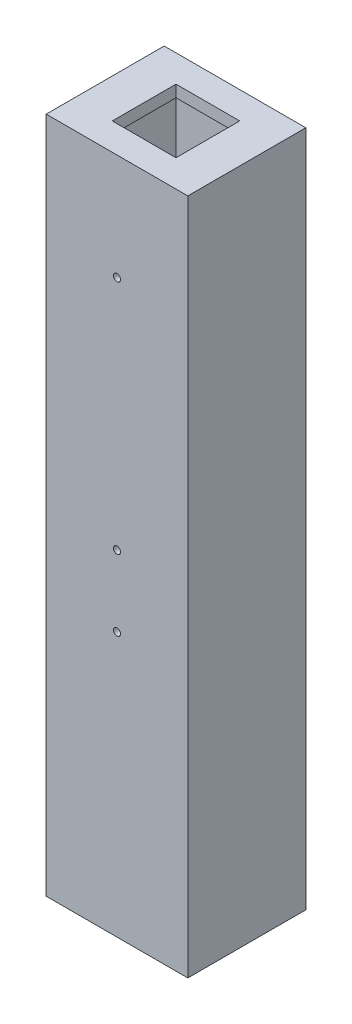
ISO-10303-21;
HEADER;
FILE_DESCRIPTION(('STEP AP214'),'2;1');
FILE_NAME('part.step','',(''),(''),'','','');
FILE_SCHEMA(('AUTOMOTIVE_DESIGN { 1 0 10303 214 1 1 1 1 }'));
ENDSEC;
DATA;
#1=APPLICATION_CONTEXT('core data for automotive mechanical design processes');
#2=APPLICATION_PROTOCOL_DEFINITION('international standard','automotive_design',2000,#1);
#3=PRODUCT_CONTEXT('',#1,'mechanical');
#4=PRODUCT('Part','Part','',(#3));
#5=PRODUCT_RELATED_PRODUCT_CATEGORY('part','',(#4));
#6=PRODUCT_DEFINITION_FORMATION('','',#4);
#7=PRODUCT_DEFINITION_CONTEXT('part definition',#1,'design');
#8=PRODUCT_DEFINITION('design','',#6,#7);
#9=PRODUCT_DEFINITION_SHAPE('','',#8);
#10=(LENGTH_UNIT() NAMED_UNIT(*) SI_UNIT(.MILLI.,.METRE.));
#11=(NAMED_UNIT(*) PLANE_ANGLE_UNIT() SI_UNIT($,.RADIAN.));
#12=(NAMED_UNIT(*) SI_UNIT($,.STERADIAN.) SOLID_ANGLE_UNIT());
#13=UNCERTAINTY_MEASURE_WITH_UNIT(LENGTH_MEASURE(1.E-05),#10,'distance_accuracy_value','');
#14=(GEOMETRIC_REPRESENTATION_CONTEXT(3) GLOBAL_UNCERTAINTY_ASSIGNED_CONTEXT((#13)) GLOBAL_UNIT_ASSIGNED_CONTEXT((#10,
#11,#12)) REPRESENTATION_CONTEXT('',''));
#15=CARTESIAN_POINT('',(0.,0.,0.));
#16=DIRECTION('',(0.,0.,1.));
#17=DIRECTION('',(1.,0.,0.));
#18=AXIS2_PLACEMENT_3D('',#15,#16,#17);
#19=CARTESIAN_POINT('',(0.,0.,0.));
#20=DIRECTION('',(0.,1.,0.));
#21=DIRECTION('',(0.,0.,1.));
#22=AXIS2_PLACEMENT_3D('',#19,#20,#21);
#23=PLANE('',#22);
#24=DIRECTION('',(1.,0.,0.));
#25=VECTOR('',#24,1.);
#26=CARTESIAN_POINT('',(0.,0.,-3.1));
#27=LINE('',#26,#25);
#28=CARTESIAN_POINT('',(-3.1,0.,-3.1));
#29=VERTEX_POINT('',#28);
#30=CARTESIAN_POINT('',(3.1,0.,-3.1));
#31=VERTEX_POINT('',#30);
#32=EDGE_CURVE('E294',#29,#31,#27,.T.);
#33=ORIENTED_EDGE('',*,*,#32,.F.);
#34=DIRECTION('',(0.,0.,1.));
#35=VECTOR('',#34,1.);
#36=CARTESIAN_POINT('',(-3.1,0.,0.));
#37=LINE('',#36,#35);
#38=CARTESIAN_POINT('',(-3.1,0.,3.1));
#39=VERTEX_POINT('',#38);
#40=EDGE_CURVE('E299',#29,#39,#37,.T.);
#41=ORIENTED_EDGE('',*,*,#40,.T.);
#42=DIRECTION('',(1.,0.,0.));
#43=VECTOR('',#42,1.);
#44=CARTESIAN_POINT('',(0.,0.,3.1));
#45=LINE('',#44,#43);
#46=CARTESIAN_POINT('',(3.1,0.,3.1));
#47=VERTEX_POINT('',#46);
#48=EDGE_CURVE('E312',#39,#47,#45,.T.);
#49=ORIENTED_EDGE('',*,*,#48,.T.);
#50=DIRECTION('',(0.,0.,1.));
#51=VECTOR('',#50,1.);
#52=CARTESIAN_POINT('',(3.1,0.,0.));
#53=LINE('',#52,#51);
#54=EDGE_CURVE('E309',#31,#47,#53,.T.);
#55=ORIENTED_EDGE('',*,*,#54,.F.);
#56=EDGE_LOOP('',(#33,#41,#49,#55));
#57=FACE_BOUND('',#56,.T.);
#58=DIRECTION('',(1.,0.,0.));
#59=VECTOR('',#58,1.);
#60=CARTESIAN_POINT('',(-3.6,0.,3.6));
#61=LINE('',#60,#59);
#62=CARTESIAN_POINT('',(-3.6,0.,3.6));
#63=VERTEX_POINT('',#62);
#64=CARTESIAN_POINT('',(3.6,0.,3.6));
#65=VERTEX_POINT('',#64);
#66=EDGE_CURVE('E106',#63,#65,#61,.T.);
#67=ORIENTED_EDGE('',*,*,#66,.F.);
#68=DIRECTION('',(0.,0.,-1.));
#69=VECTOR('',#68,1.);
#70=CARTESIAN_POINT('',(-3.6,0.,3.6));
#71=LINE('',#70,#69);
#72=CARTESIAN_POINT('',(-3.6,0.,-3.6));
#73=VERTEX_POINT('',#72);
#74=EDGE_CURVE('E111',#63,#73,#71,.T.);
#75=ORIENTED_EDGE('',*,*,#74,.T.);
#76=DIRECTION('',(1.,0.,0.));
#77=VECTOR('',#76,1.);
#78=CARTESIAN_POINT('',(-3.6,0.,-3.6));
#79=LINE('',#78,#77);
#80=CARTESIAN_POINT('',(3.6,0.,-3.6));
#81=VERTEX_POINT('',#80);
#82=EDGE_CURVE('E226',#73,#81,#79,.T.);
#83=ORIENTED_EDGE('',*,*,#82,.T.);
#84=DIRECTION('',(0.,0.,-1.));
#85=VECTOR('',#84,1.);
#86=CARTESIAN_POINT('',(3.6,0.,3.6));
#87=LINE('',#86,#85);
#88=EDGE_CURVE('E235',#65,#81,#87,.T.);
#89=ORIENTED_EDGE('',*,*,#88,.F.);
#90=EDGE_LOOP('',(#67,#75,#83,#89));
#91=FACE_BOUND('',#90,.T.);
#92=ADVANCED_FACE('F91',(#57,#91),#23,.F.);
#93=CARTESIAN_POINT('',(0.,54.,-3.1));
#94=DIRECTION('',(0.,0.,-1.));
#95=DIRECTION('',(-1.,0.,0.));
#96=AXIS2_PLACEMENT_3D('',#93,#94,#95);
#97=PLANE('',#96);
#98=CARTESIAN_POINT('',(0.,19.,-3.1));
#99=DIRECTION('',(0.,0.,-1.));
#100=DIRECTION('',(-1.,0.,0.));
#101=AXIS2_PLACEMENT_3D('',#98,#99,#100);
#102=CIRCLE('',#101,0.299999999999996);
#103=CARTESIAN_POINT('',(-0.299999999999998,19.,-3.1));
#104=VERTEX_POINT('',#103);
#105=EDGE_CURVE('E450',#104,#104,#102,.T.);
#106=ORIENTED_EDGE('',*,*,#105,.T.);
#107=EDGE_LOOP('',(#106));
#108=FACE_BOUND('',#107,.T.);
#109=CARTESIAN_POINT('',(0.,25.,-3.1));
#110=DIRECTION('',(0.,0.,-1.));
#111=DIRECTION('',(-1.,0.,0.));
#112=AXIS2_PLACEMENT_3D('',#109,#110,#111);
#113=CIRCLE('',#112,0.299999999999998);
#114=CARTESIAN_POINT('',(-0.3,25.,-3.1));
#115=VERTEX_POINT('',#114);
#116=EDGE_CURVE('E444',#115,#115,#113,.T.);
#117=ORIENTED_EDGE('',*,*,#116,.T.);
#118=EDGE_LOOP('',(#117));
#119=FACE_BOUND('',#118,.T.);
#120=CARTESIAN_POINT('',(0.,45.,-3.1));
#121=DIRECTION('',(0.,0.,-1.));
#122=DIRECTION('',(-1.,0.,0.));
#123=AXIS2_PLACEMENT_3D('',#120,#121,#122);
#124=CIRCLE('',#123,0.299999999999999);
#125=CARTESIAN_POINT('',(-0.300000000000001,45.,-3.1));
#126=VERTEX_POINT('',#125);
#127=EDGE_CURVE('E437',#126,#126,#124,.T.);
#128=ORIENTED_EDGE('',*,*,#127,.T.);
#129=EDGE_LOOP('',(#128));
#130=FACE_BOUND('',#129,.T.);
#131=DIRECTION('',(1.,0.,0.));
#132=VECTOR('',#131,1.);
#133=CARTESIAN_POINT('',(0.,53.,-3.1));
#134=LINE('',#133,#132);
#135=CARTESIAN_POINT('',(-3.1,53.,-3.1));
#136=VERTEX_POINT('',#135);
#137=CARTESIAN_POINT('',(3.1,53.,-3.1));
#138=VERTEX_POINT('',#137);
#139=EDGE_CURVE('E292',#136,#138,#134,.T.);
#140=ORIENTED_EDGE('',*,*,#139,.F.);
#141=DIRECTION('',(0.,-1.,0.));
#142=VECTOR('',#141,1.);
#143=CARTESIAN_POINT('',(-3.1,54.,-3.1));
#144=LINE('',#143,#142);
#145=EDGE_CURVE('E317',#136,#29,#144,.T.);
#146=ORIENTED_EDGE('',*,*,#145,.T.);
#147=ORIENTED_EDGE('',*,*,#32,.T.);
#148=DIRECTION('',(0.,-1.,0.));
#149=VECTOR('',#148,1.);
#150=CARTESIAN_POINT('',(3.1,54.,-3.1));
#151=LINE('',#150,#149);
#152=EDGE_CURVE('E99',#138,#31,#151,.T.);
#153=ORIENTED_EDGE('',*,*,#152,.F.);
#154=EDGE_LOOP('',(#140,#146,#147,#153));
#155=FACE_BOUND('',#154,.T.);
#156=ADVANCED_FACE('F380',(#108,#119,#130,#155),#97,.F.);
#157=CARTESIAN_POINT('',(3.1,54.,0.));
#158=DIRECTION('',(1.,0.,0.));
#159=DIRECTION('',(0.,0.,-1.));
#160=AXIS2_PLACEMENT_3D('',#157,#158,#159);
#161=PLANE('',#160);
#162=DIRECTION('',(0.,0.,1.));
#163=VECTOR('',#162,1.);
#164=CARTESIAN_POINT('',(3.1,53.,0.));
#165=LINE('',#164,#163);
#166=CARTESIAN_POINT('',(3.1,53.,3.1));
#167=VERTEX_POINT('',#166);
#168=EDGE_CURVE('E290',#138,#167,#165,.T.);
#169=ORIENTED_EDGE('',*,*,#168,.F.);
#170=ORIENTED_EDGE('',*,*,#152,.T.);
#171=ORIENTED_EDGE('',*,*,#54,.T.);
#172=DIRECTION('',(0.,-1.,0.));
#173=VECTOR('',#172,1.);
#174=CARTESIAN_POINT('',(3.1,54.,3.1));
#175=LINE('',#174,#173);
#176=EDGE_CURVE('E322',#167,#47,#175,.T.);
#177=ORIENTED_EDGE('',*,*,#176,.F.);
#178=EDGE_LOOP('',(#169,#170,#171,#177));
#179=FACE_BOUND('',#178,.T.);
#180=ADVANCED_FACE('F387',(#179),#161,.F.);
#181=CARTESIAN_POINT('',(0.,54.,3.1));
#182=DIRECTION('',(0.,0.,-1.));
#183=DIRECTION('',(-1.,0.,0.));
#184=AXIS2_PLACEMENT_3D('',#181,#182,#183);
#185=PLANE('',#184);
#186=CARTESIAN_POINT('',(0.,19.,3.1));
#187=DIRECTION('',(0.,0.,-1.));
#188=DIRECTION('',(-1.,0.,0.));
#189=AXIS2_PLACEMENT_3D('',#186,#187,#188);
#190=CIRCLE('',#189,0.299999999999996);
#191=CARTESIAN_POINT('',(-0.299999999999998,19.,3.1));
#192=VERTEX_POINT('',#191);
#193=EDGE_CURVE('E447',#192,#192,#190,.T.);
#194=ORIENTED_EDGE('',*,*,#193,.F.);
#195=EDGE_LOOP('',(#194));
#196=FACE_BOUND('',#195,.T.);
#197=CARTESIAN_POINT('',(0.,25.,3.1));
#198=DIRECTION('',(0.,0.,-1.));
#199=DIRECTION('',(-1.,0.,0.));
#200=AXIS2_PLACEMENT_3D('',#197,#198,#199);
#201=CIRCLE('',#200,0.299999999999998);
#202=CARTESIAN_POINT('',(-0.3,25.,3.1));
#203=VERTEX_POINT('',#202);
#204=EDGE_CURVE('E441',#203,#203,#201,.T.);
#205=ORIENTED_EDGE('',*,*,#204,.F.);
#206=EDGE_LOOP('',(#205));
#207=FACE_BOUND('',#206,.T.);
#208=CARTESIAN_POINT('',(0.,45.,3.1));
#209=DIRECTION('',(0.,0.,-1.));
#210=DIRECTION('',(-1.,0.,0.));
#211=AXIS2_PLACEMENT_3D('',#208,#209,#210);
#212=CIRCLE('',#211,0.299999999999999);
#213=CARTESIAN_POINT('',(-0.300000000000001,45.,3.1));
#214=VERTEX_POINT('',#213);
#215=EDGE_CURVE('E434',#214,#214,#212,.T.);
#216=ORIENTED_EDGE('',*,*,#215,.F.);
#217=EDGE_LOOP('',(#216));
#218=FACE_BOUND('',#217,.T.);
#219=DIRECTION('',(0.,-1.,0.));
#220=VECTOR('',#219,1.);
#221=CARTESIAN_POINT('',(-3.1,54.,3.1));
#222=LINE('',#221,#220);
#223=CARTESIAN_POINT('',(-3.1,53.,3.1));
#224=VERTEX_POINT('',#223);
#225=EDGE_CURVE('E319',#224,#39,#222,.T.);
#226=ORIENTED_EDGE('',*,*,#225,.F.);
#227=DIRECTION('',(1.,0.,0.));
#228=VECTOR('',#227,1.);
#229=CARTESIAN_POINT('',(0.,53.,3.1));
#230=LINE('',#229,#228);
#231=EDGE_CURVE('E281',#224,#167,#230,.T.);
#232=ORIENTED_EDGE('',*,*,#231,.T.);
#233=ORIENTED_EDGE('',*,*,#176,.T.);
#234=ORIENTED_EDGE('',*,*,#48,.F.);
#235=EDGE_LOOP('',(#226,#232,#233,#234));
#236=FACE_BOUND('',#235,.T.);
#237=ADVANCED_FACE('F396',(#196,#207,#218,#236),#185,.T.);
#238=CARTESIAN_POINT('',(-3.1,54.,0.));
#239=DIRECTION('',(1.,0.,0.));
#240=DIRECTION('',(0.,0.,-1.));
#241=AXIS2_PLACEMENT_3D('',#238,#239,#240);
#242=PLANE('',#241);
#243=ORIENTED_EDGE('',*,*,#145,.F.);
#244=DIRECTION('',(0.,0.,1.));
#245=VECTOR('',#244,1.);
#246=CARTESIAN_POINT('',(-3.1,53.,0.));
#247=LINE('',#246,#245);
#248=EDGE_CURVE('E12',#136,#224,#247,.T.);
#249=ORIENTED_EDGE('',*,*,#248,.T.);
#250=ORIENTED_EDGE('',*,*,#225,.T.);
#251=ORIENTED_EDGE('',*,*,#40,.F.);
#252=EDGE_LOOP('',(#243,#249,#250,#251));
#253=FACE_BOUND('',#252,.T.);
#254=ADVANCED_FACE('F393',(#253),#242,.T.);
#255=CARTESIAN_POINT('',(6.,54.,0.));
#256=DIRECTION('',(1.,0.,0.));
#257=DIRECTION('',(0.,0.,-1.));
#258=AXIS2_PLACEMENT_3D('',#255,#256,#257);
#259=PLANE('',#258);
#260=DIRECTION('',(0.,-1.,0.));
#261=VECTOR('',#260,1.);
#262=CARTESIAN_POINT('',(6.,54.,5.));
#263=LINE('',#262,#261);
#264=CARTESIAN_POINT('',(6.,54.,5.));
#265=VERTEX_POINT('',#264);
#266=CARTESIAN_POINT('',(6.,-3.4,5.));
#267=VERTEX_POINT('',#266);
#268=EDGE_CURVE('E306',#265,#267,#263,.T.);
#269=ORIENTED_EDGE('',*,*,#268,.T.);
#270=DIRECTION('',(0.,0.,-1.));
#271=VECTOR('',#270,1.);
#272=CARTESIAN_POINT('',(6.,-3.4,5.));
#273=LINE('',#272,#271);
#274=CARTESIAN_POINT('',(6.,-3.4,-5.));
#275=VERTEX_POINT('',#274);
#276=EDGE_CURVE('E247',#267,#275,#273,.T.);
#277=ORIENTED_EDGE('',*,*,#276,.T.);
#278=DIRECTION('',(0.,-1.,0.));
#279=VECTOR('',#278,1.);
#280=CARTESIAN_POINT('',(6.,54.,-5.));
#281=LINE('',#280,#279);
#282=CARTESIAN_POINT('',(6.,54.,-5.));
#283=VERTEX_POINT('',#282);
#284=EDGE_CURVE('E320',#283,#275,#281,.T.);
#285=ORIENTED_EDGE('',*,*,#284,.F.);
#286=DIRECTION('',(0.,0.,1.));
#287=VECTOR('',#286,1.);
#288=CARTESIAN_POINT('',(6.,54.,0.));
#289=LINE('',#288,#287);
#290=EDGE_CURVE('E295',#283,#265,#289,.T.);
#291=ORIENTED_EDGE('',*,*,#290,.T.);
#292=EDGE_LOOP('',(#269,#277,#285,#291));
#293=FACE_BOUND('',#292,.T.);
#294=ADVANCED_FACE('F93',(#293),#259,.T.);
#295=CARTESIAN_POINT('',(0.,54.,-5.));
#296=DIRECTION('',(0.,0.,-1.));
#297=DIRECTION('',(-1.,0.,0.));
#298=AXIS2_PLACEMENT_3D('',#295,#296,#297);
#299=PLANE('',#298);
#300=CARTESIAN_POINT('',(0.,19.,-5.));
#301=DIRECTION('',(0.,0.,-1.));
#302=DIRECTION('',(-1.,0.,0.));
#303=AXIS2_PLACEMENT_3D('',#300,#301,#302);
#304=CIRCLE('',#303,0.299999999999996);
#305=CARTESIAN_POINT('',(-0.299999999999998,19.,-5.));
#306=VERTEX_POINT('',#305);
#307=EDGE_CURVE('E416',#306,#306,#304,.T.);
#308=ORIENTED_EDGE('',*,*,#307,.F.);
#309=EDGE_LOOP('',(#308));
#310=FACE_BOUND('',#309,.T.);
#311=CARTESIAN_POINT('',(0.,25.,-5.));
#312=DIRECTION('',(0.,0.,-1.));
#313=DIRECTION('',(-1.,0.,0.));
#314=AXIS2_PLACEMENT_3D('',#311,#312,#313);
#315=CIRCLE('',#314,0.299999999999998);
#316=CARTESIAN_POINT('',(-0.3,25.,-5.));
#317=VERTEX_POINT('',#316);
#318=EDGE_CURVE('E420',#317,#317,#315,.T.);
#319=ORIENTED_EDGE('',*,*,#318,.F.);
#320=EDGE_LOOP('',(#319));
#321=FACE_BOUND('',#320,.T.);
#322=CARTESIAN_POINT('',(0.,45.,-5.));
#323=DIRECTION('',(0.,0.,-1.));
#324=DIRECTION('',(-1.,0.,0.));
#325=AXIS2_PLACEMENT_3D('',#322,#323,#324);
#326=CIRCLE('',#325,0.299999999999999);
#327=CARTESIAN_POINT('',(-0.300000000000001,45.,-5.));
#328=VERTEX_POINT('',#327);
#329=EDGE_CURVE('E423',#328,#328,#326,.T.);
#330=ORIENTED_EDGE('',*,*,#329,.F.);
#331=EDGE_LOOP('',(#330));
#332=FACE_BOUND('',#331,.T.);
#333=ORIENTED_EDGE('',*,*,#284,.T.);
#334=DIRECTION('',(1.,0.,0.));
#335=VECTOR('',#334,1.);
#336=CARTESIAN_POINT('',(-6.,-3.4,-5.));
#337=LINE('',#336,#335);
#338=CARTESIAN_POINT('',(-6.,-3.4,-5.));
#339=VERTEX_POINT('',#338);
#340=EDGE_CURVE('E250',#339,#275,#337,.T.);
#341=ORIENTED_EDGE('',*,*,#340,.F.);
#342=DIRECTION('',(0.,-1.,0.));
#343=VECTOR('',#342,1.);
#344=CARTESIAN_POINT('',(-6.,54.,-5.));
#345=LINE('',#344,#343);
#346=CARTESIAN_POINT('',(-6.,54.,-5.));
#347=VERTEX_POINT('',#346);
#348=EDGE_CURVE('E328',#347,#339,#345,.T.);
#349=ORIENTED_EDGE('',*,*,#348,.F.);
#350=DIRECTION('',(1.,0.,0.));
#351=VECTOR('',#350,1.);
#352=CARTESIAN_POINT('',(0.,54.,-5.));
#353=LINE('',#352,#351);
#354=EDGE_CURVE('E298',#347,#283,#353,.T.);
#355=ORIENTED_EDGE('',*,*,#354,.T.);
#356=EDGE_LOOP('',(#333,#341,#349,#355));
#357=FACE_BOUND('',#356,.T.);
#358=ADVANCED_FACE('F331',(#310,#321,#332,#357),#299,.T.);
#359=CARTESIAN_POINT('',(-6.,54.,0.));
#360=DIRECTION('',(1.,0.,0.));
#361=DIRECTION('',(0.,0.,-1.));
#362=AXIS2_PLACEMENT_3D('',#359,#360,#361);
#363=PLANE('',#362);
#364=ORIENTED_EDGE('',*,*,#348,.T.);
#365=DIRECTION('',(0.,0.,-1.));
#366=VECTOR('',#365,1.);
#367=CARTESIAN_POINT('',(-6.,-3.4,5.));
#368=LINE('',#367,#366);
#369=CARTESIAN_POINT('',(-6.,-3.4,5.));
#370=VERTEX_POINT('',#369);
#371=EDGE_CURVE('E253',#370,#339,#368,.T.);
#372=ORIENTED_EDGE('',*,*,#371,.F.);
#373=DIRECTION('',(0.,-1.,0.));
#374=VECTOR('',#373,1.);
#375=CARTESIAN_POINT('',(-6.,54.,5.));
#376=LINE('',#375,#374);
#377=CARTESIAN_POINT('',(-6.,54.,5.));
#378=VERTEX_POINT('',#377);
#379=EDGE_CURVE('E326',#378,#370,#376,.T.);
#380=ORIENTED_EDGE('',*,*,#379,.F.);
#381=DIRECTION('',(0.,0.,1.));
#382=VECTOR('',#381,1.);
#383=CARTESIAN_POINT('',(-6.,54.,0.));
#384=LINE('',#383,#382);
#385=EDGE_CURVE('E302',#347,#378,#384,.T.);
#386=ORIENTED_EDGE('',*,*,#385,.F.);
#387=EDGE_LOOP('',(#364,#372,#380,#386));
#388=FACE_BOUND('',#387,.T.);
#389=ADVANCED_FACE('F345',(#388),#363,.F.);
#390=CARTESIAN_POINT('',(0.,54.,5.));
#391=DIRECTION('',(0.,0.,-1.));
#392=DIRECTION('',(-1.,0.,0.));
#393=AXIS2_PLACEMENT_3D('',#390,#391,#392);
#394=PLANE('',#393);
#395=CARTESIAN_POINT('',(0.,19.,5.));
#396=DIRECTION('',(0.,0.,-1.));
#397=DIRECTION('',(-1.,0.,0.));
#398=AXIS2_PLACEMENT_3D('',#395,#396,#397);
#399=CIRCLE('',#398,0.299999999999996);
#400=CARTESIAN_POINT('',(-0.299999999999998,19.,5.));
#401=VERTEX_POINT('',#400);
#402=EDGE_CURVE('E438',#401,#401,#399,.T.);
#403=ORIENTED_EDGE('',*,*,#402,.T.);
#404=EDGE_LOOP('',(#403));
#405=FACE_BOUND('',#404,.T.);
#406=CARTESIAN_POINT('',(0.,25.,5.));
#407=DIRECTION('',(0.,0.,-1.));
#408=DIRECTION('',(-1.,0.,0.));
#409=AXIS2_PLACEMENT_3D('',#406,#407,#408);
#410=CIRCLE('',#409,0.299999999999998);
#411=CARTESIAN_POINT('',(-0.3,25.,5.));
#412=VERTEX_POINT('',#411);
#413=EDGE_CURVE('E425',#412,#412,#410,.T.);
#414=ORIENTED_EDGE('',*,*,#413,.T.);
#415=EDGE_LOOP('',(#414));
#416=FACE_BOUND('',#415,.T.);
#417=CARTESIAN_POINT('',(0.,45.,5.));
#418=DIRECTION('',(0.,0.,-1.));
#419=DIRECTION('',(-1.,0.,0.));
#420=AXIS2_PLACEMENT_3D('',#417,#418,#419);
#421=CIRCLE('',#420,0.299999999999999);
#422=CARTESIAN_POINT('',(-0.300000000000001,45.,5.));
#423=VERTEX_POINT('',#422);
#424=EDGE_CURVE('E426',#423,#423,#421,.T.);
#425=ORIENTED_EDGE('',*,*,#424,.T.);
#426=EDGE_LOOP('',(#425));
#427=FACE_BOUND('',#426,.T.);
#428=ORIENTED_EDGE('',*,*,#379,.T.);
#429=DIRECTION('',(1.,0.,0.));
#430=VECTOR('',#429,1.);
#431=CARTESIAN_POINT('',(-6.,-3.4,5.));
#432=LINE('',#431,#430);
#433=EDGE_CURVE('E241',#370,#267,#432,.T.);
#434=ORIENTED_EDGE('',*,*,#433,.T.);
#435=ORIENTED_EDGE('',*,*,#268,.F.);
#436=DIRECTION('',(1.,0.,0.));
#437=VECTOR('',#436,1.);
#438=CARTESIAN_POINT('',(0.,54.,5.));
#439=LINE('',#438,#437);
#440=EDGE_CURVE('E304',#378,#265,#439,.T.);
#441=ORIENTED_EDGE('',*,*,#440,.F.);
#442=EDGE_LOOP('',(#428,#434,#435,#441));
#443=FACE_BOUND('',#442,.T.);
#444=ADVANCED_FACE('F341',(#405,#416,#427,#443),#394,.F.);
#445=CARTESIAN_POINT('',(0.,54.,0.));
#446=DIRECTION('',(0.,1.,0.));
#447=DIRECTION('',(0.,0.,1.));
#448=AXIS2_PLACEMENT_3D('',#445,#446,#447);
#449=PLANE('',#448);
#450=ORIENTED_EDGE('',*,*,#290,.F.);
#451=ORIENTED_EDGE('',*,*,#354,.F.);
#452=ORIENTED_EDGE('',*,*,#385,.T.);
#453=ORIENTED_EDGE('',*,*,#440,.T.);
#454=EDGE_LOOP('',(#450,#451,#452,#453));
#455=FACE_BOUND('',#454,.T.);
#456=DIRECTION('',(-1.,0.,0.));
#457=VECTOR('',#456,1.);
#458=CARTESIAN_POINT('',(0.,54.,-2.7));
#459=LINE('',#458,#457);
#460=CARTESIAN_POINT('',(2.7,54.,-2.7));
#461=VERTEX_POINT('',#460);
#462=CARTESIAN_POINT('',(-2.7,54.,-2.7));
#463=VERTEX_POINT('',#462);
#464=EDGE_CURVE('E256',#461,#463,#459,.T.);
#465=ORIENTED_EDGE('',*,*,#464,.F.);
#466=DIRECTION('',(0.,0.,1.));
#467=VECTOR('',#466,1.);
#468=CARTESIAN_POINT('',(2.7,54.,0.));
#469=LINE('',#468,#467);
#470=CARTESIAN_POINT('',(2.7,54.,2.7));
#471=VERTEX_POINT('',#470);
#472=EDGE_CURVE('E261',#461,#471,#469,.T.);
#473=ORIENTED_EDGE('',*,*,#472,.T.);
#474=DIRECTION('',(-1.,0.,0.));
#475=VECTOR('',#474,1.);
#476=CARTESIAN_POINT('',(0.,54.,2.7));
#477=LINE('',#476,#475);
#478=CARTESIAN_POINT('',(-2.7,54.,2.7));
#479=VERTEX_POINT('',#478);
#480=EDGE_CURVE('E274',#471,#479,#477,.T.);
#481=ORIENTED_EDGE('',*,*,#480,.T.);
#482=DIRECTION('',(0.,0.,1.));
#483=VECTOR('',#482,1.);
#484=CARTESIAN_POINT('',(-2.7,54.,0.));
#485=LINE('',#484,#483);
#486=EDGE_CURVE('E271',#463,#479,#485,.T.);
#487=ORIENTED_EDGE('',*,*,#486,.F.);
#488=EDGE_LOOP('',(#465,#473,#481,#487));
#489=FACE_BOUND('',#488,.T.);
#490=ADVANCED_FACE('F347',(#455,#489),#449,.T.);
#491=CARTESIAN_POINT('',(0.,53.,0.));
#492=DIRECTION('',(0.,1.,0.));
#493=DIRECTION('',(0.,0.,1.));
#494=AXIS2_PLACEMENT_3D('',#491,#492,#493);
#495=PLANE('',#494);
#496=DIRECTION('',(0.,0.,1.));
#497=VECTOR('',#496,1.);
#498=CARTESIAN_POINT('',(2.7,53.,0.));
#499=LINE('',#498,#497);
#500=CARTESIAN_POINT('',(2.7,53.,-2.7));
#501=VERTEX_POINT('',#500);
#502=CARTESIAN_POINT('',(2.7,53.,2.7));
#503=VERTEX_POINT('',#502);
#504=EDGE_CURVE('E267',#501,#503,#499,.T.);
#505=ORIENTED_EDGE('',*,*,#504,.F.);
#506=DIRECTION('',(-1.,0.,0.));
#507=VECTOR('',#506,1.);
#508=CARTESIAN_POINT('',(0.,53.,-2.7));
#509=LINE('',#508,#507);
#510=CARTESIAN_POINT('',(-2.7,53.,-2.7));
#511=VERTEX_POINT('',#510);
#512=EDGE_CURVE('E257',#501,#511,#509,.T.);
#513=ORIENTED_EDGE('',*,*,#512,.T.);
#514=DIRECTION('',(0.,0.,1.));
#515=VECTOR('',#514,1.);
#516=CARTESIAN_POINT('',(-2.7,53.,0.));
#517=LINE('',#516,#515);
#518=CARTESIAN_POINT('',(-2.7,53.,2.7));
#519=VERTEX_POINT('',#518);
#520=EDGE_CURVE('E260',#511,#519,#517,.T.);
#521=ORIENTED_EDGE('',*,*,#520,.T.);
#522=DIRECTION('',(-1.,0.,0.));
#523=VECTOR('',#522,1.);
#524=CARTESIAN_POINT('',(0.,53.,2.7));
#525=LINE('',#524,#523);
#526=EDGE_CURVE('E264',#503,#519,#525,.T.);
#527=ORIENTED_EDGE('',*,*,#526,.F.);
#528=EDGE_LOOP('',(#505,#513,#521,#527));
#529=FACE_BOUND('',#528,.T.);
#530=ORIENTED_EDGE('',*,*,#248,.F.);
#531=ORIENTED_EDGE('',*,*,#139,.T.);
#532=ORIENTED_EDGE('',*,*,#168,.T.);
#533=ORIENTED_EDGE('',*,*,#231,.F.);
#534=EDGE_LOOP('',(#530,#531,#532,#533));
#535=FACE_BOUND('',#534,.T.);
#536=ADVANCED_FACE('F350',(#529,#535),#495,.F.);
#537=CARTESIAN_POINT('',(0.,53.,-2.7));
#538=DIRECTION('',(0.,0.,-1.));
#539=DIRECTION('',(-1.,0.,0.));
#540=AXIS2_PLACEMENT_3D('',#537,#538,#539);
#541=PLANE('',#540);
#542=ORIENTED_EDGE('',*,*,#464,.T.);
#543=DIRECTION('',(0.,1.,0.));
#544=VECTOR('',#543,1.);
#545=CARTESIAN_POINT('',(-2.7,53.,-2.7));
#546=LINE('',#545,#544);
#547=EDGE_CURVE('E269',#511,#463,#546,.T.);
#548=ORIENTED_EDGE('',*,*,#547,.F.);
#549=ORIENTED_EDGE('',*,*,#512,.F.);
#550=DIRECTION('',(0.,1.,0.));
#551=VECTOR('',#550,1.);
#552=CARTESIAN_POINT('',(2.7,53.,-2.7));
#553=LINE('',#552,#551);
#554=EDGE_CURVE('E279',#501,#461,#553,.T.);
#555=ORIENTED_EDGE('',*,*,#554,.T.);
#556=EDGE_LOOP('',(#542,#548,#549,#555));
#557=FACE_BOUND('',#556,.T.);
#558=ADVANCED_FACE('F356',(#557),#541,.F.);
#559=CARTESIAN_POINT('',(2.7,53.,0.));
#560=DIRECTION('',(-1.,0.,0.));
#561=DIRECTION('',(0.,0.,1.));
#562=AXIS2_PLACEMENT_3D('',#559,#560,#561);
#563=PLANE('',#562);
#564=ORIENTED_EDGE('',*,*,#472,.F.);
#565=ORIENTED_EDGE('',*,*,#554,.F.);
#566=ORIENTED_EDGE('',*,*,#504,.T.);
#567=DIRECTION('',(0.,1.,0.));
#568=VECTOR('',#567,1.);
#569=CARTESIAN_POINT('',(2.7,53.,2.7));
#570=LINE('',#569,#568);
#571=EDGE_CURVE('E282',#503,#471,#570,.T.);
#572=ORIENTED_EDGE('',*,*,#571,.T.);
#573=EDGE_LOOP('',(#564,#565,#566,#572));
#574=FACE_BOUND('',#573,.T.);
#575=ADVANCED_FACE('F367',(#574),#563,.T.);
#576=CARTESIAN_POINT('',(0.,53.,2.7));
#577=DIRECTION('',(0.,0.,-1.));
#578=DIRECTION('',(-1.,0.,0.));
#579=AXIS2_PLACEMENT_3D('',#576,#577,#578);
#580=PLANE('',#579);
#581=ORIENTED_EDGE('',*,*,#480,.F.);
#582=ORIENTED_EDGE('',*,*,#571,.F.);
#583=ORIENTED_EDGE('',*,*,#526,.T.);
#584=DIRECTION('',(0.,1.,0.));
#585=VECTOR('',#584,1.);
#586=CARTESIAN_POINT('',(-2.7,53.,2.7));
#587=LINE('',#586,#585);
#588=EDGE_CURVE('E284',#519,#479,#587,.T.);
#589=ORIENTED_EDGE('',*,*,#588,.T.);
#590=EDGE_LOOP('',(#581,#582,#583,#589));
#591=FACE_BOUND('',#590,.T.);
#592=ADVANCED_FACE('F370',(#591),#580,.T.);
#593=CARTESIAN_POINT('',(-2.7,53.,0.));
#594=DIRECTION('',(-1.,0.,0.));
#595=DIRECTION('',(0.,0.,1.));
#596=AXIS2_PLACEMENT_3D('',#593,#594,#595);
#597=PLANE('',#596);
#598=ORIENTED_EDGE('',*,*,#486,.T.);
#599=ORIENTED_EDGE('',*,*,#588,.F.);
#600=ORIENTED_EDGE('',*,*,#520,.F.);
#601=ORIENTED_EDGE('',*,*,#547,.T.);
#602=EDGE_LOOP('',(#598,#599,#600,#601));
#603=FACE_BOUND('',#602,.T.);
#604=ADVANCED_FACE('F360',(#603),#597,.F.);
#605=CARTESIAN_POINT('',(0.,-3.4,0.));
#606=DIRECTION('',(0.,1.,0.));
#607=DIRECTION('',(0.,0.,1.));
#608=AXIS2_PLACEMENT_3D('',#605,#606,#607);
#609=PLANE('',#608);
#610=CARTESIAN_POINT('',(4.5,-3.4,3.5));
#611=DIRECTION('',(0.,-1.,0.));
#612=DIRECTION('',(0.,0.,-1.));
#613=AXIS2_PLACEMENT_3D('',#610,#611,#612);
#614=CIRCLE('',#613,0.3);
#615=CARTESIAN_POINT('',(4.5,-3.4,3.2));
#616=VERTEX_POINT('',#615);
#617=EDGE_CURVE('E460',#616,#616,#614,.T.);
#618=ORIENTED_EDGE('',*,*,#617,.F.);
#619=EDGE_LOOP('',(#618));
#620=FACE_BOUND('',#619,.T.);
#621=CARTESIAN_POINT('',(-4.5,-3.4,-3.5));
#622=DIRECTION('',(0.,-1.,0.));
#623=DIRECTION('',(0.,0.,-1.));
#624=AXIS2_PLACEMENT_3D('',#621,#622,#623);
#625=CIRCLE('',#624,0.3);
#626=CARTESIAN_POINT('',(-4.5,-3.4,-3.8));
#627=VERTEX_POINT('',#626);
#628=EDGE_CURVE('E466',#627,#627,#625,.T.);
#629=ORIENTED_EDGE('',*,*,#628,.F.);
#630=EDGE_LOOP('',(#629));
#631=FACE_BOUND('',#630,.T.);
#632=CARTESIAN_POINT('',(4.5,-3.4,-3.5));
#633=DIRECTION('',(0.,-1.,0.));
#634=DIRECTION('',(0.,0.,-1.));
#635=AXIS2_PLACEMENT_3D('',#632,#633,#634);
#636=CIRCLE('',#635,0.3);
#637=CARTESIAN_POINT('',(4.5,-3.4,-3.8));
#638=VERTEX_POINT('',#637);
#639=EDGE_CURVE('E454',#638,#638,#636,.T.);
#640=ORIENTED_EDGE('',*,*,#639,.F.);
#641=EDGE_LOOP('',(#640));
#642=FACE_BOUND('',#641,.T.);
#643=CARTESIAN_POINT('',(-4.5,-3.4,3.5));
#644=DIRECTION('',(0.,-1.,0.));
#645=DIRECTION('',(0.,0.,-1.));
#646=AXIS2_PLACEMENT_3D('',#643,#644,#645);
#647=CIRCLE('',#646,0.3);
#648=CARTESIAN_POINT('',(-4.5,-3.4,3.2));
#649=VERTEX_POINT('',#648);
#650=EDGE_CURVE('E229',#649,#649,#647,.T.);
#651=ORIENTED_EDGE('',*,*,#650,.F.);
#652=EDGE_LOOP('',(#651));
#653=FACE_BOUND('',#652,.T.);
#654=DIRECTION('',(0.,0.,-1.));
#655=VECTOR('',#654,1.);
#656=CARTESIAN_POINT('',(-3.6,-3.4,3.6));
#657=LINE('',#656,#655);
#658=CARTESIAN_POINT('',(-3.6,-3.4,3.6));
#659=VERTEX_POINT('',#658);
#660=CARTESIAN_POINT('',(-3.6,-3.4,-3.6));
#661=VERTEX_POINT('',#660);
#662=EDGE_CURVE('E212',#659,#661,#657,.T.);
#663=ORIENTED_EDGE('',*,*,#662,.F.);
#664=DIRECTION('',(1.,0.,0.));
#665=VECTOR('',#664,1.);
#666=CARTESIAN_POINT('',(-3.6,-3.4,3.6));
#667=LINE('',#666,#665);
#668=CARTESIAN_POINT('',(3.6,-3.4,3.6));
#669=VERTEX_POINT('',#668);
#670=EDGE_CURVE('E207',#659,#669,#667,.T.);
#671=ORIENTED_EDGE('',*,*,#670,.T.);
#672=DIRECTION('',(0.,0.,-1.));
#673=VECTOR('',#672,1.);
#674=CARTESIAN_POINT('',(3.6,-3.4,3.6));
#675=LINE('',#674,#673);
#676=CARTESIAN_POINT('',(3.6,-3.4,-3.6));
#677=VERTEX_POINT('',#676);
#678=EDGE_CURVE('E215',#669,#677,#675,.T.);
#679=ORIENTED_EDGE('',*,*,#678,.T.);
#680=DIRECTION('',(1.,0.,0.));
#681=VECTOR('',#680,1.);
#682=CARTESIAN_POINT('',(-3.6,-3.4,-3.6));
#683=LINE('',#682,#681);
#684=EDGE_CURVE('E221',#661,#677,#683,.T.);
#685=ORIENTED_EDGE('',*,*,#684,.F.);
#686=EDGE_LOOP('',(#663,#671,#679,#685));
#687=FACE_BOUND('',#686,.T.);
#688=ORIENTED_EDGE('',*,*,#433,.F.);
#689=ORIENTED_EDGE('',*,*,#371,.T.);
#690=ORIENTED_EDGE('',*,*,#340,.T.);
#691=ORIENTED_EDGE('',*,*,#276,.F.);
#692=EDGE_LOOP('',(#688,#689,#690,#691));
#693=FACE_BOUND('',#692,.T.);
#694=ADVANCED_FACE('F223',(#620,#631,#642,#653,#687,#693),#609,.F.);
#695=CARTESIAN_POINT('',(-3.6,-3.4,3.6));
#696=DIRECTION('',(0.,0.,1.));
#697=DIRECTION('',(1.,0.,0.));
#698=AXIS2_PLACEMENT_3D('',#695,#696,#697);
#699=PLANE('',#698);
#700=ORIENTED_EDGE('',*,*,#66,.T.);
#701=DIRECTION('',(0.,1.,0.));
#702=VECTOR('',#701,1.);
#703=CARTESIAN_POINT('',(3.6,-3.4,3.6));
#704=LINE('',#703,#702);
#705=EDGE_CURVE('E203',#669,#65,#704,.T.);
#706=ORIENTED_EDGE('',*,*,#705,.F.);
#707=ORIENTED_EDGE('',*,*,#670,.F.);
#708=DIRECTION('',(0.,1.,0.));
#709=VECTOR('',#708,1.);
#710=CARTESIAN_POINT('',(-3.6,-3.4,3.6));
#711=LINE('',#710,#709);
#712=EDGE_CURVE('E239',#659,#63,#711,.T.);
#713=ORIENTED_EDGE('',*,*,#712,.T.);
#714=EDGE_LOOP('',(#700,#706,#707,#713));
#715=FACE_BOUND('',#714,.T.);
#716=ADVANCED_FACE('F205',(#715),#699,.F.);
#717=CARTESIAN_POINT('',(-3.6,-3.4,3.6));
#718=DIRECTION('',(1.,0.,0.));
#719=DIRECTION('',(0.,0.,-1.));
#720=AXIS2_PLACEMENT_3D('',#717,#718,#719);
#721=PLANE('',#720);
#722=ORIENTED_EDGE('',*,*,#74,.F.);
#723=ORIENTED_EDGE('',*,*,#712,.F.);
#724=ORIENTED_EDGE('',*,*,#662,.T.);
#725=DIRECTION('',(0.,1.,0.));
#726=VECTOR('',#725,1.);
#727=CARTESIAN_POINT('',(-3.6,-3.4,-3.6));
#728=LINE('',#727,#726);
#729=EDGE_CURVE('E242',#661,#73,#728,.T.);
#730=ORIENTED_EDGE('',*,*,#729,.T.);
#731=EDGE_LOOP('',(#722,#723,#724,#730));
#732=FACE_BOUND('',#731,.T.);
#733=ADVANCED_FACE('F484',(#732),#721,.T.);
#734=CARTESIAN_POINT('',(-3.6,-3.4,-3.6));
#735=DIRECTION('',(0.,0.,1.));
#736=DIRECTION('',(1.,0.,0.));
#737=AXIS2_PLACEMENT_3D('',#734,#735,#736);
#738=PLANE('',#737);
#739=ORIENTED_EDGE('',*,*,#82,.F.);
#740=ORIENTED_EDGE('',*,*,#729,.F.);
#741=ORIENTED_EDGE('',*,*,#684,.T.);
#742=DIRECTION('',(0.,1.,0.));
#743=VECTOR('',#742,1.);
#744=CARTESIAN_POINT('',(3.6,-3.4,-3.6));
#745=LINE('',#744,#743);
#746=EDGE_CURVE('E211',#677,#81,#745,.T.);
#747=ORIENTED_EDGE('',*,*,#746,.T.);
#748=EDGE_LOOP('',(#739,#740,#741,#747));
#749=FACE_BOUND('',#748,.T.);
#750=ADVANCED_FACE('F491',(#749),#738,.T.);
#751=CARTESIAN_POINT('',(3.6,-3.4,3.6));
#752=DIRECTION('',(1.,0.,0.));
#753=DIRECTION('',(0.,0.,-1.));
#754=AXIS2_PLACEMENT_3D('',#751,#752,#753);
#755=PLANE('',#754);
#756=ORIENTED_EDGE('',*,*,#88,.T.);
#757=ORIENTED_EDGE('',*,*,#746,.F.);
#758=ORIENTED_EDGE('',*,*,#678,.F.);
#759=ORIENTED_EDGE('',*,*,#705,.T.);
#760=EDGE_LOOP('',(#756,#757,#758,#759));
#761=FACE_BOUND('',#760,.T.);
#762=ADVANCED_FACE('F216',(#761),#755,.F.);
#763=CARTESIAN_POINT('',(-4.5,-1.4,3.5));
#764=DIRECTION('',(0.,-1.,0.));
#765=DIRECTION('',(0.,0.,-1.));
#766=AXIS2_PLACEMENT_3D('',#763,#764,#765);
#767=CYLINDRICAL_SURFACE('',#766,0.3);
#768=CARTESIAN_POINT('',(-4.5,-1.4,3.5));
#769=DIRECTION('',(0.,-1.,0.));
#770=DIRECTION('',(0.,0.,-1.));
#771=AXIS2_PLACEMENT_3D('',#768,#769,#770);
#772=CIRCLE('',#771,0.3);
#773=CARTESIAN_POINT('',(-4.5,-1.4,3.2));
#774=VERTEX_POINT('',#773);
#775=EDGE_CURVE('E236',#774,#774,#772,.T.);
#776=ORIENTED_EDGE('',*,*,#775,.F.);
#777=EDGE_LOOP('',(#776));
#778=FACE_BOUND('',#777,.T.);
#779=ORIENTED_EDGE('',*,*,#650,.T.);
#780=EDGE_LOOP('',(#779));
#781=FACE_BOUND('',#780,.T.);
#782=ADVANCED_FACE('F476',(#778,#781),#767,.F.);
#783=CARTESIAN_POINT('',(-4.5,-1.4,3.5));
#784=DIRECTION('',(0.,-1.,0.));
#785=DIRECTION('',(0.,0.,-1.));
#786=AXIS2_PLACEMENT_3D('',#783,#784,#785);
#787=PLANE('',#786);
#788=ORIENTED_EDGE('',*,*,#775,.T.);
#789=EDGE_LOOP('',(#788));
#790=FACE_BOUND('',#789,.T.);
#791=ADVANCED_FACE('F500',(#790),#787,.T.);
#792=CARTESIAN_POINT('',(4.5,-1.4,-3.5));
#793=DIRECTION('',(0.,-1.,0.));
#794=DIRECTION('',(0.,0.,-1.));
#795=AXIS2_PLACEMENT_3D('',#792,#793,#794);
#796=CYLINDRICAL_SURFACE('',#795,0.3);
#797=CARTESIAN_POINT('',(4.5,-1.4,-3.5));
#798=DIRECTION('',(0.,-1.,0.));
#799=DIRECTION('',(0.,0.,-1.));
#800=AXIS2_PLACEMENT_3D('',#797,#798,#799);
#801=CIRCLE('',#800,0.3);
#802=CARTESIAN_POINT('',(4.5,-1.4,-3.8));
#803=VERTEX_POINT('',#802);
#804=EDGE_CURVE('E453',#803,#803,#801,.T.);
#805=ORIENTED_EDGE('',*,*,#804,.F.);
#806=EDGE_LOOP('',(#805));
#807=FACE_BOUND('',#806,.T.);
#808=ORIENTED_EDGE('',*,*,#639,.T.);
#809=EDGE_LOOP('',(#808));
#810=FACE_BOUND('',#809,.T.);
#811=ADVANCED_FACE('F504',(#807,#810),#796,.F.);
#812=CARTESIAN_POINT('',(4.5,-1.4,-3.5));
#813=DIRECTION('',(0.,-1.,0.));
#814=DIRECTION('',(0.,0.,-1.));
#815=AXIS2_PLACEMENT_3D('',#812,#813,#814);
#816=PLANE('',#815);
#817=ORIENTED_EDGE('',*,*,#804,.T.);
#818=EDGE_LOOP('',(#817));
#819=FACE_BOUND('',#818,.T.);
#820=ADVANCED_FACE('F513',(#819),#816,.T.);
#821=CARTESIAN_POINT('',(-4.5,-1.4,-3.5));
#822=DIRECTION('',(0.,-1.,0.));
#823=DIRECTION('',(0.,0.,-1.));
#824=AXIS2_PLACEMENT_3D('',#821,#822,#823);
#825=CYLINDRICAL_SURFACE('',#824,0.3);
#826=CARTESIAN_POINT('',(-4.5,-1.4,-3.5));
#827=DIRECTION('',(0.,-1.,0.));
#828=DIRECTION('',(0.,0.,-1.));
#829=AXIS2_PLACEMENT_3D('',#826,#827,#828);
#830=CIRCLE('',#829,0.3);
#831=CARTESIAN_POINT('',(-4.5,-1.4,-3.8));
#832=VERTEX_POINT('',#831);
#833=EDGE_CURVE('E457',#832,#832,#830,.T.);
#834=ORIENTED_EDGE('',*,*,#833,.F.);
#835=EDGE_LOOP('',(#834));
#836=FACE_BOUND('',#835,.T.);
#837=ORIENTED_EDGE('',*,*,#628,.T.);
#838=EDGE_LOOP('',(#837));
#839=FACE_BOUND('',#838,.T.);
#840=ADVANCED_FACE('F509',(#836,#839),#825,.F.);
#841=CARTESIAN_POINT('',(-4.5,-1.4,-3.5));
#842=DIRECTION('',(0.,-1.,0.));
#843=DIRECTION('',(0.,0.,-1.));
#844=AXIS2_PLACEMENT_3D('',#841,#842,#843);
#845=PLANE('',#844);
#846=ORIENTED_EDGE('',*,*,#833,.T.);
#847=EDGE_LOOP('',(#846));
#848=FACE_BOUND('',#847,.T.);
#849=ADVANCED_FACE('F505',(#848),#845,.T.);
#850=CARTESIAN_POINT('',(4.5,-1.4,3.5));
#851=DIRECTION('',(0.,-1.,0.));
#852=DIRECTION('',(0.,0.,-1.));
#853=AXIS2_PLACEMENT_3D('',#850,#851,#852);
#854=CYLINDRICAL_SURFACE('',#853,0.3);
#855=CARTESIAN_POINT('',(4.5,-1.4,3.5));
#856=DIRECTION('',(0.,-1.,0.));
#857=DIRECTION('',(0.,0.,-1.));
#858=AXIS2_PLACEMENT_3D('',#855,#856,#857);
#859=CIRCLE('',#858,0.3);
#860=CARTESIAN_POINT('',(4.5,-1.4,3.2));
#861=VERTEX_POINT('',#860);
#862=EDGE_CURVE('E463',#861,#861,#859,.T.);
#863=ORIENTED_EDGE('',*,*,#862,.F.);
#864=EDGE_LOOP('',(#863));
#865=FACE_BOUND('',#864,.T.);
#866=ORIENTED_EDGE('',*,*,#617,.T.);
#867=EDGE_LOOP('',(#866));
#868=FACE_BOUND('',#867,.T.);
#869=ADVANCED_FACE('F508',(#865,#868),#854,.F.);
#870=CARTESIAN_POINT('',(4.5,-1.4,3.5));
#871=DIRECTION('',(0.,-1.,0.));
#872=DIRECTION('',(0.,0.,-1.));
#873=AXIS2_PLACEMENT_3D('',#870,#871,#872);
#874=PLANE('',#873);
#875=ORIENTED_EDGE('',*,*,#862,.T.);
#876=EDGE_LOOP('',(#875));
#877=FACE_BOUND('',#876,.T.);
#878=ADVANCED_FACE('F515',(#877),#874,.T.);
#879=CARTESIAN_POINT('',(0.,45.,5.));
#880=DIRECTION('',(0.,0.,-1.));
#881=DIRECTION('',(-1.,0.,0.));
#882=AXIS2_PLACEMENT_3D('',#879,#880,#881);
#883=CYLINDRICAL_SURFACE('',#882,0.299999999999999);
#884=ORIENTED_EDGE('',*,*,#215,.T.);
#885=EDGE_LOOP('',(#884));
#886=FACE_BOUND('',#885,.T.);
#887=ORIENTED_EDGE('',*,*,#424,.F.);
#888=EDGE_LOOP('',(#887));
#889=FACE_BOUND('',#888,.T.);
#890=ADVANCED_FACE('F518',(#886,#889),#883,.F.);
#891=CARTESIAN_POINT('',(0.,25.,5.));
#892=DIRECTION('',(0.,0.,-1.));
#893=DIRECTION('',(-1.,0.,0.));
#894=AXIS2_PLACEMENT_3D('',#891,#892,#893);
#895=CYLINDRICAL_SURFACE('',#894,0.299999999999998);
#896=ORIENTED_EDGE('',*,*,#204,.T.);
#897=EDGE_LOOP('',(#896));
#898=FACE_BOUND('',#897,.T.);
#899=ORIENTED_EDGE('',*,*,#413,.F.);
#900=EDGE_LOOP('',(#899));
#901=FACE_BOUND('',#900,.T.);
#902=ADVANCED_FACE('F531',(#898,#901),#895,.F.);
#903=CARTESIAN_POINT('',(0.,19.,5.));
#904=DIRECTION('',(0.,0.,-1.));
#905=DIRECTION('',(-1.,0.,0.));
#906=AXIS2_PLACEMENT_3D('',#903,#904,#905);
#907=CYLINDRICAL_SURFACE('',#906,0.299999999999996);
#908=ORIENTED_EDGE('',*,*,#193,.T.);
#909=EDGE_LOOP('',(#908));
#910=FACE_BOUND('',#909,.T.);
#911=ORIENTED_EDGE('',*,*,#402,.F.);
#912=EDGE_LOOP('',(#911));
#913=FACE_BOUND('',#912,.T.);
#914=ADVANCED_FACE('F536',(#910,#913),#907,.F.);
#915=ORIENTED_EDGE('',*,*,#329,.T.);
#916=EDGE_LOOP('',(#915));
#917=FACE_BOUND('',#916,.T.);
#918=ORIENTED_EDGE('',*,*,#127,.F.);
#919=EDGE_LOOP('',(#918));
#920=FACE_BOUND('',#919,.T.);
#921=ADVANCED_FACE('F533',(#917,#920),#883,.F.);
#922=ORIENTED_EDGE('',*,*,#318,.T.);
#923=EDGE_LOOP('',(#922));
#924=FACE_BOUND('',#923,.T.);
#925=ORIENTED_EDGE('',*,*,#116,.F.);
#926=EDGE_LOOP('',(#925));
#927=FACE_BOUND('',#926,.T.);
#928=ADVANCED_FACE('F538',(#924,#927),#895,.F.);
#929=ORIENTED_EDGE('',*,*,#307,.T.);
#930=EDGE_LOOP('',(#929));
#931=FACE_BOUND('',#930,.T.);
#932=ORIENTED_EDGE('',*,*,#105,.F.);
#933=EDGE_LOOP('',(#932));
#934=FACE_BOUND('',#933,.T.);
#935=ADVANCED_FACE('F541',(#931,#934),#907,.F.);
#936=CLOSED_SHELL('',(#92,#156,#180,#237,#254,#294,#358,#389,#444,#490,#536,#558,#575,#592,#604,
#694,#716,#733,#750,#762,#782,#791,#811,#820,#840,#849,#869,#878,#890,#902,#914,#921,#928,#935));
#937=MANIFOLD_SOLID_BREP('B2',#936);
#938=ADVANCED_BREP_SHAPE_REPRESENTATION('',(#18,#937),#14);
#939=SHAPE_DEFINITION_REPRESENTATION(#9,#938);
ENDSEC;
END-ISO-10303-21;
